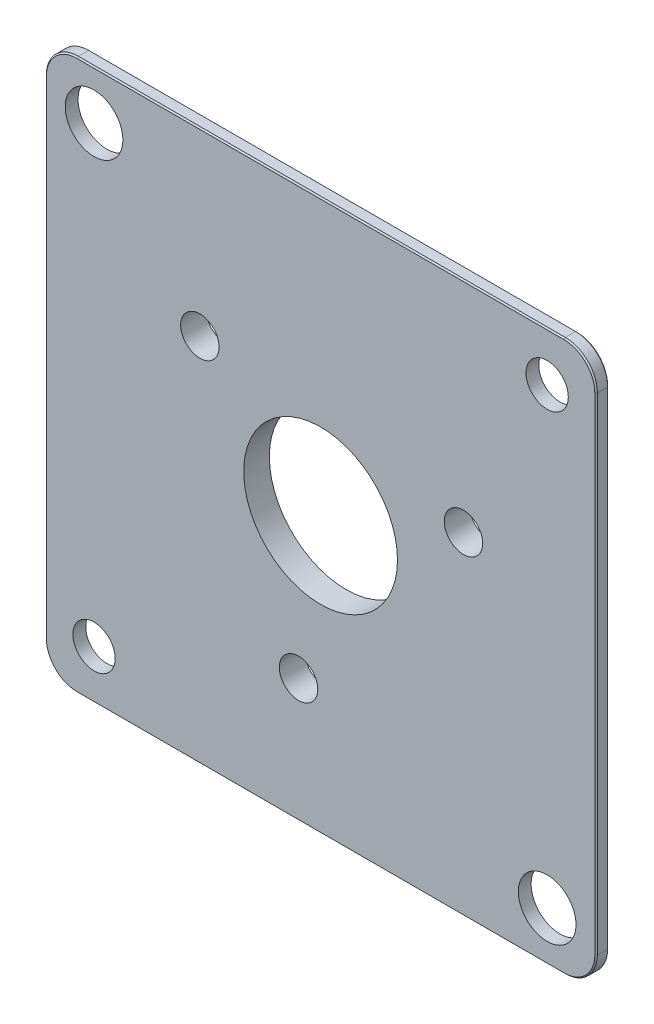
ISO-10303-21;
HEADER;
FILE_DESCRIPTION(('STEP AP214'),'2;1');
FILE_NAME('part.step','',(''),(''),'','','');
FILE_SCHEMA(('AUTOMOTIVE_DESIGN { 1 0 10303 214 1 1 1 1 }'));
ENDSEC;
DATA;
#1=APPLICATION_CONTEXT('core data for automotive mechanical design processes');
#2=APPLICATION_PROTOCOL_DEFINITION('international standard','automotive_design',2000,#1);
#3=PRODUCT_CONTEXT('',#1,'mechanical');
#4=PRODUCT('Part','Part','',(#3));
#5=PRODUCT_RELATED_PRODUCT_CATEGORY('part','',(#4));
#6=PRODUCT_DEFINITION_FORMATION('','',#4);
#7=PRODUCT_DEFINITION_CONTEXT('part definition',#1,'design');
#8=PRODUCT_DEFINITION('design','',#6,#7);
#9=PRODUCT_DEFINITION_SHAPE('','',#8);
#10=(LENGTH_UNIT() NAMED_UNIT(*) SI_UNIT(.MILLI.,.METRE.));
#11=(NAMED_UNIT(*) PLANE_ANGLE_UNIT() SI_UNIT($,.RADIAN.));
#12=(NAMED_UNIT(*) SI_UNIT($,.STERADIAN.) SOLID_ANGLE_UNIT());
#13=UNCERTAINTY_MEASURE_WITH_UNIT(LENGTH_MEASURE(1.E-05),#10,'distance_accuracy_value','');
#14=(GEOMETRIC_REPRESENTATION_CONTEXT(3) GLOBAL_UNCERTAINTY_ASSIGNED_CONTEXT((#13)) GLOBAL_UNIT_ASSIGNED_CONTEXT((#10,
#11,#12)) REPRESENTATION_CONTEXT('',''));
#15=CARTESIAN_POINT('',(0.,0.,0.));
#16=DIRECTION('',(0.,0.,1.));
#17=DIRECTION('',(1.,0.,0.));
#18=AXIS2_PLACEMENT_3D('',#15,#16,#17);
#19=CARTESIAN_POINT('',(0.,0.,0.5));
#20=DIRECTION('',(0.,0.,-1.));
#21=DIRECTION('',(-1.,0.,0.));
#22=AXIS2_PLACEMENT_3D('',#19,#20,#21);
#23=PLANE('',#22);
#24=CARTESIAN_POINT('',(-9.42,7.43,0.5));
#25=DIRECTION('',(0.,0.,1.));
#26=DIRECTION('',(1.,0.,0.));
#27=AXIS2_PLACEMENT_3D('',#24,#25,#26);
#28=CIRCLE('',#27,1.5);
#29=CARTESIAN_POINT('',(-7.92,7.43,0.5));
#30=VERTEX_POINT('',#29);
#31=EDGE_CURVE('E295',#30,#30,#28,.T.);
#32=ORIENTED_EDGE('',*,*,#31,.F.);
#33=EDGE_LOOP('',(#32));
#34=FACE_BOUND('',#33,.T.);
#35=CARTESIAN_POINT('',(11.15,4.45,0.5));
#36=DIRECTION('',(0.,0.,1.));
#37=DIRECTION('',(1.,0.,0.));
#38=AXIS2_PLACEMENT_3D('',#35,#36,#37);
#39=CIRCLE('',#38,1.5);
#40=CARTESIAN_POINT('',(12.65,4.45,0.5));
#41=VERTEX_POINT('',#40);
#42=EDGE_CURVE('E415',#41,#41,#39,.T.);
#43=ORIENTED_EDGE('',*,*,#42,.F.);
#44=EDGE_LOOP('',(#43));
#45=FACE_BOUND('',#44,.T.);
#46=CARTESIAN_POINT('',(-1.72,-11.85,0.5));
#47=DIRECTION('',(0.,0.,1.));
#48=DIRECTION('',(1.,0.,0.));
#49=AXIS2_PLACEMENT_3D('',#46,#47,#48);
#50=CIRCLE('',#49,1.5);
#51=CARTESIAN_POINT('',(-0.219999999999996,-11.85,0.5));
#52=VERTEX_POINT('',#51);
#53=EDGE_CURVE('E411',#52,#52,#50,.T.);
#54=ORIENTED_EDGE('',*,*,#53,.F.);
#55=EDGE_LOOP('',(#54));
#56=FACE_BOUND('',#55,.T.);
#57=CARTESIAN_POINT('',(19.,-19.,0.5));
#58=DIRECTION('',(0.,0.,-1.));
#59=DIRECTION('',(-1.,0.,0.));
#60=AXIS2_PLACEMENT_3D('',#57,#58,#59);
#61=CIRCLE('',#60,2.4);
#62=CARTESIAN_POINT('',(19.,-21.4,0.5));
#63=VERTEX_POINT('',#62);
#64=CARTESIAN_POINT('',(21.4,-19.,0.5));
#65=VERTEX_POINT('',#64);
#66=EDGE_CURVE('E70',#63,#65,#61,.F.);
#67=ORIENTED_EDGE('',*,*,#66,.T.);
#68=DIRECTION('',(0.,1.,0.));
#69=VECTOR('',#68,1.);
#70=CARTESIAN_POINT('',(21.4,0.,0.5));
#71=LINE('',#70,#69);
#72=CARTESIAN_POINT('',(21.4,19.,0.5));
#73=VERTEX_POINT('',#72);
#74=EDGE_CURVE('E58',#65,#73,#71,.T.);
#75=ORIENTED_EDGE('',*,*,#74,.T.);
#76=CARTESIAN_POINT('',(19.,19.,0.5));
#77=DIRECTION('',(0.,0.,-1.));
#78=DIRECTION('',(-1.,0.,0.));
#79=AXIS2_PLACEMENT_3D('',#76,#77,#78);
#80=CIRCLE('',#79,2.4);
#81=CARTESIAN_POINT('',(19.,21.4,0.5));
#82=VERTEX_POINT('',#81);
#83=EDGE_CURVE('E255',#73,#82,#80,.F.);
#84=ORIENTED_EDGE('',*,*,#83,.T.);
#85=DIRECTION('',(-1.,0.,0.));
#86=VECTOR('',#85,1.);
#87=CARTESIAN_POINT('',(0.,21.4,0.5));
#88=LINE('',#87,#86);
#89=CARTESIAN_POINT('',(-19.,21.4,0.5));
#90=VERTEX_POINT('',#89);
#91=EDGE_CURVE('E249',#82,#90,#88,.T.);
#92=ORIENTED_EDGE('',*,*,#91,.T.);
#93=CARTESIAN_POINT('',(-19.,19.,0.5));
#94=DIRECTION('',(0.,0.,-1.));
#95=DIRECTION('',(-1.,0.,0.));
#96=AXIS2_PLACEMENT_3D('',#93,#94,#95);
#97=CIRCLE('',#96,2.4);
#98=CARTESIAN_POINT('',(-21.4,19.,0.5));
#99=VERTEX_POINT('',#98);
#100=EDGE_CURVE('E244',#90,#99,#97,.F.);
#101=ORIENTED_EDGE('',*,*,#100,.T.);
#102=DIRECTION('',(0.,-1.,0.));
#103=VECTOR('',#102,1.);
#104=CARTESIAN_POINT('',(-21.4,0.,0.5));
#105=LINE('',#104,#103);
#106=CARTESIAN_POINT('',(-21.4,-19.,0.5));
#107=VERTEX_POINT('',#106);
#108=EDGE_CURVE('E238',#99,#107,#105,.T.);
#109=ORIENTED_EDGE('',*,*,#108,.T.);
#110=CARTESIAN_POINT('',(-19.,-19.,0.5));
#111=DIRECTION('',(0.,0.,-1.));
#112=DIRECTION('',(-1.,0.,0.));
#113=AXIS2_PLACEMENT_3D('',#110,#111,#112);
#114=CIRCLE('',#113,2.4);
#115=CARTESIAN_POINT('',(-19.,-21.4,0.5));
#116=VERTEX_POINT('',#115);
#117=EDGE_CURVE('E241',#107,#116,#114,.F.);
#118=ORIENTED_EDGE('',*,*,#117,.T.);
#119=DIRECTION('',(1.,0.,0.));
#120=VECTOR('',#119,1.);
#121=CARTESIAN_POINT('',(0.,-21.4,0.5));
#122=LINE('',#121,#120);
#123=EDGE_CURVE('E193',#116,#63,#122,.T.);
#124=ORIENTED_EDGE('',*,*,#123,.T.);
#125=EDGE_LOOP('',(#67,#75,#84,#92,#101,#109,#118,#124));
#126=FACE_BOUND('',#125,.T.);
#127=CARTESIAN_POINT('',(0.,0.,0.5));
#128=DIRECTION('',(0.,0.,1.));
#129=DIRECTION('',(1.,0.,0.));
#130=AXIS2_PLACEMENT_3D('',#127,#128,#129);
#131=CIRCLE('',#130,6.);
#132=CARTESIAN_POINT('',(6.,0.,0.5));
#133=VERTEX_POINT('',#132);
#134=EDGE_CURVE('E290',#133,#133,#131,.T.);
#135=ORIENTED_EDGE('',*,*,#134,.F.);
#136=EDGE_LOOP('',(#135));
#137=FACE_BOUND('',#136,.T.);
#138=CARTESIAN_POINT('',(-17.68,17.68,0.5));
#139=DIRECTION('',(0.,0.,1.));
#140=DIRECTION('',(1.,0.,0.));
#141=AXIS2_PLACEMENT_3D('',#138,#139,#140);
#142=CIRCLE('',#141,2.25);
#143=CARTESIAN_POINT('',(-15.43,17.68,0.5));
#144=VERTEX_POINT('',#143);
#145=EDGE_CURVE('E376',#144,#144,#142,.T.);
#146=ORIENTED_EDGE('',*,*,#145,.F.);
#147=EDGE_LOOP('',(#146));
#148=FACE_BOUND('',#147,.T.);
#149=CARTESIAN_POINT('',(17.68,-17.68,0.5));
#150=DIRECTION('',(0.,0.,1.));
#151=DIRECTION('',(1.,0.,0.));
#152=AXIS2_PLACEMENT_3D('',#149,#150,#151);
#153=CIRCLE('',#152,2.25);
#154=CARTESIAN_POINT('',(19.93,-17.68,0.5));
#155=VERTEX_POINT('',#154);
#156=EDGE_CURVE('E381',#155,#155,#153,.T.);
#157=ORIENTED_EDGE('',*,*,#156,.F.);
#158=EDGE_LOOP('',(#157));
#159=FACE_BOUND('',#158,.T.);
#160=CARTESIAN_POINT('',(17.68,17.68,0.5));
#161=DIRECTION('',(0.,0.,1.));
#162=DIRECTION('',(1.,0.,0.));
#163=AXIS2_PLACEMENT_3D('',#160,#161,#162);
#164=CIRCLE('',#163,1.65);
#165=CARTESIAN_POINT('',(19.33,17.68,0.5));
#166=VERTEX_POINT('',#165);
#167=EDGE_CURVE('E389',#166,#166,#164,.T.);
#168=ORIENTED_EDGE('',*,*,#167,.F.);
#169=EDGE_LOOP('',(#168));
#170=FACE_BOUND('',#169,.T.);
#171=CARTESIAN_POINT('',(-17.68,-17.68,0.5));
#172=DIRECTION('',(0.,0.,1.));
#173=DIRECTION('',(1.,0.,0.));
#174=AXIS2_PLACEMENT_3D('',#171,#172,#173);
#175=CIRCLE('',#174,1.65);
#176=CARTESIAN_POINT('',(-16.03,-17.68,0.5));
#177=VERTEX_POINT('',#176);
#178=EDGE_CURVE('E397',#177,#177,#175,.T.);
#179=ORIENTED_EDGE('',*,*,#178,.F.);
#180=EDGE_LOOP('',(#179));
#181=FACE_BOUND('',#180,.T.);
#182=ADVANCED_FACE('F47',(#34,#45,#56,#126,#137,#148,#159,#170,#181),#23,.F.);
#183=CARTESIAN_POINT('',(0.,0.,-0.5));
#184=DIRECTION('',(0.,0.,-1.));
#185=DIRECTION('',(-1.,0.,0.));
#186=AXIS2_PLACEMENT_3D('',#183,#184,#185);
#187=PLANE('',#186);
#188=CARTESIAN_POINT('',(0.,0.,-0.5));
#189=DIRECTION('',(0.,0.,-1.));
#190=DIRECTION('',(-1.,0.,0.));
#191=AXIS2_PLACEMENT_3D('',#188,#189,#190);
#192=CIRCLE('',#191,16.);
#193=CARTESIAN_POINT('',(-16.,0.,-0.5));
#194=VERTEX_POINT('',#193);
#195=EDGE_CURVE('E11',#194,#194,#192,.T.);
#196=ORIENTED_EDGE('',*,*,#195,.F.);
#197=EDGE_LOOP('',(#196));
#198=FACE_BOUND('',#197,.T.);
#199=DIRECTION('',(0.,-1.,0.));
#200=VECTOR('',#199,1.);
#201=CARTESIAN_POINT('',(21.4,-19.,-0.5));
#202=LINE('',#201,#200);
#203=CARTESIAN_POINT('',(21.4,19.,-0.5));
#204=VERTEX_POINT('',#203);
#205=CARTESIAN_POINT('',(21.4,-19.,-0.5));
#206=VERTEX_POINT('',#205);
#207=EDGE_CURVE('E333',#204,#206,#202,.T.);
#208=ORIENTED_EDGE('',*,*,#207,.T.);
#209=CARTESIAN_POINT('',(19.,-19.,-0.5));
#210=DIRECTION('',(0.,0.,-1.));
#211=DIRECTION('',(-1.,0.,0.));
#212=AXIS2_PLACEMENT_3D('',#209,#210,#211);
#213=CIRCLE('',#212,2.4);
#214=CARTESIAN_POINT('',(19.,-21.4,-0.5));
#215=VERTEX_POINT('',#214);
#216=EDGE_CURVE('E326',#206,#215,#213,.T.);
#217=ORIENTED_EDGE('',*,*,#216,.T.);
#218=DIRECTION('',(-1.,0.,0.));
#219=VECTOR('',#218,1.);
#220=CARTESIAN_POINT('',(-19.,-21.4,-0.5));
#221=LINE('',#220,#219);
#222=CARTESIAN_POINT('',(-19.,-21.4,-0.5));
#223=VERTEX_POINT('',#222);
#224=EDGE_CURVE('E329',#215,#223,#221,.T.);
#225=ORIENTED_EDGE('',*,*,#224,.T.);
#226=CARTESIAN_POINT('',(-19.,-19.,-0.5));
#227=DIRECTION('',(0.,0.,-1.));
#228=DIRECTION('',(-1.,0.,0.));
#229=AXIS2_PLACEMENT_3D('',#226,#227,#228);
#230=CIRCLE('',#229,2.4);
#231=CARTESIAN_POINT('',(-21.4,-19.,-0.5));
#232=VERTEX_POINT('',#231);
#233=EDGE_CURVE('E336',#223,#232,#230,.T.);
#234=ORIENTED_EDGE('',*,*,#233,.T.);
#235=DIRECTION('',(0.,1.,0.));
#236=VECTOR('',#235,1.);
#237=CARTESIAN_POINT('',(-21.4,19.,-0.5));
#238=LINE('',#237,#236);
#239=CARTESIAN_POINT('',(-21.4,19.,-0.5));
#240=VERTEX_POINT('',#239);
#241=EDGE_CURVE('E339',#232,#240,#238,.T.);
#242=ORIENTED_EDGE('',*,*,#241,.T.);
#243=CARTESIAN_POINT('',(-19.,19.,-0.5));
#244=DIRECTION('',(0.,0.,-1.));
#245=DIRECTION('',(-1.,0.,0.));
#246=AXIS2_PLACEMENT_3D('',#243,#244,#245);
#247=CIRCLE('',#246,2.4);
#248=CARTESIAN_POINT('',(-19.,21.4,-0.5));
#249=VERTEX_POINT('',#248);
#250=EDGE_CURVE('E345',#240,#249,#247,.T.);
#251=ORIENTED_EDGE('',*,*,#250,.T.);
#252=DIRECTION('',(1.,0.,0.));
#253=VECTOR('',#252,1.);
#254=CARTESIAN_POINT('',(19.,21.4,-0.5));
#255=LINE('',#254,#253);
#256=CARTESIAN_POINT('',(19.,21.4,-0.5));
#257=VERTEX_POINT('',#256);
#258=EDGE_CURVE('E348',#249,#257,#255,.T.);
#259=ORIENTED_EDGE('',*,*,#258,.T.);
#260=CARTESIAN_POINT('',(19.,19.,-0.5));
#261=DIRECTION('',(0.,0.,-1.));
#262=DIRECTION('',(-1.,0.,0.));
#263=AXIS2_PLACEMENT_3D('',#260,#261,#262);
#264=CIRCLE('',#263,2.4);
#265=EDGE_CURVE('E342',#257,#204,#264,.T.);
#266=ORIENTED_EDGE('',*,*,#265,.T.);
#267=EDGE_LOOP('',(#208,#217,#225,#234,#242,#251,#259,#266));
#268=FACE_BOUND('',#267,.T.);
#269=CARTESIAN_POINT('',(17.68,17.68,-0.5));
#270=DIRECTION('',(0.,0.,1.));
#271=DIRECTION('',(1.,0.,0.));
#272=AXIS2_PLACEMENT_3D('',#269,#270,#271);
#273=CIRCLE('',#272,1.65);
#274=CARTESIAN_POINT('',(19.33,17.68,-0.5));
#275=VERTEX_POINT('',#274);
#276=EDGE_CURVE('E393',#275,#275,#273,.T.);
#277=ORIENTED_EDGE('',*,*,#276,.T.);
#278=EDGE_LOOP('',(#277));
#279=FACE_BOUND('',#278,.T.);
#280=CARTESIAN_POINT('',(-17.68,17.68,-0.5));
#281=DIRECTION('',(0.,0.,1.));
#282=DIRECTION('',(1.,0.,0.));
#283=AXIS2_PLACEMENT_3D('',#280,#281,#282);
#284=CIRCLE('',#283,2.25);
#285=CARTESIAN_POINT('',(-15.43,17.68,-0.5));
#286=VERTEX_POINT('',#285);
#287=EDGE_CURVE('E377',#286,#286,#284,.T.);
#288=ORIENTED_EDGE('',*,*,#287,.T.);
#289=EDGE_LOOP('',(#288));
#290=FACE_BOUND('',#289,.T.);
#291=CARTESIAN_POINT('',(17.68,-17.68,-0.5));
#292=DIRECTION('',(0.,0.,1.));
#293=DIRECTION('',(1.,0.,0.));
#294=AXIS2_PLACEMENT_3D('',#291,#292,#293);
#295=CIRCLE('',#294,2.25);
#296=CARTESIAN_POINT('',(19.93,-17.68,-0.5));
#297=VERTEX_POINT('',#296);
#298=EDGE_CURVE('E385',#297,#297,#295,.T.);
#299=ORIENTED_EDGE('',*,*,#298,.T.);
#300=EDGE_LOOP('',(#299));
#301=FACE_BOUND('',#300,.T.);
#302=CARTESIAN_POINT('',(-17.68,-17.68,-0.5));
#303=DIRECTION('',(0.,0.,1.));
#304=DIRECTION('',(1.,0.,0.));
#305=AXIS2_PLACEMENT_3D('',#302,#303,#304);
#306=CIRCLE('',#305,1.65);
#307=CARTESIAN_POINT('',(-16.03,-17.68,-0.5));
#308=VERTEX_POINT('',#307);
#309=EDGE_CURVE('E401',#308,#308,#306,.T.);
#310=ORIENTED_EDGE('',*,*,#309,.T.);
#311=EDGE_LOOP('',(#310));
#312=FACE_BOUND('',#311,.T.);
#313=ADVANCED_FACE('F463',(#198,#268,#279,#290,#301,#312),#187,.T.);
#314=CARTESIAN_POINT('',(21.5,-21.5,0.5));
#315=DIRECTION('',(-1.,0.,0.));
#316=DIRECTION('',(0.,0.,1.));
#317=AXIS2_PLACEMENT_3D('',#314,#315,#316);
#318=PLANE('',#317);
#319=DIRECTION('',(0.,0.,-1.));
#320=VECTOR('',#319,1.);
#321=CARTESIAN_POINT('',(21.5,-19.,0.5));
#322=LINE('',#321,#320);
#323=CARTESIAN_POINT('',(21.5,-19.,0.399999999999997));
#324=VERTEX_POINT('',#323);
#325=CARTESIAN_POINT('',(21.5,-19.,-0.399999999999997));
#326=VERTEX_POINT('',#325);
#327=EDGE_CURVE('E360',#324,#326,#322,.T.);
#328=ORIENTED_EDGE('',*,*,#327,.T.);
#329=DIRECTION('',(0.,1.,0.));
#330=VECTOR('',#329,1.);
#331=CARTESIAN_POINT('',(21.5,19.,-0.399999999999997));
#332=LINE('',#331,#330);
#333=CARTESIAN_POINT('',(21.5,19.,-0.399999999999997));
#334=VERTEX_POINT('',#333);
#335=EDGE_CURVE('E320',#326,#334,#332,.T.);
#336=ORIENTED_EDGE('',*,*,#335,.T.);
#337=DIRECTION('',(0.,0.,-1.));
#338=VECTOR('',#337,1.);
#339=CARTESIAN_POINT('',(21.5,19.,0.5));
#340=LINE('',#339,#338);
#341=CARTESIAN_POINT('',(21.5,19.,0.399999999999997));
#342=VERTEX_POINT('',#341);
#343=EDGE_CURVE('E364',#334,#342,#340,.F.);
#344=ORIENTED_EDGE('',*,*,#343,.T.);
#345=DIRECTION('',(0.,-1.,0.));
#346=VECTOR('',#345,1.);
#347=CARTESIAN_POINT('',(21.5,-21.5,0.399999999999997));
#348=LINE('',#347,#346);
#349=EDGE_CURVE('E313',#342,#324,#348,.T.);
#350=ORIENTED_EDGE('',*,*,#349,.T.);
#351=EDGE_LOOP('',(#328,#336,#344,#350));
#352=FACE_BOUND('',#351,.T.);
#353=ADVANCED_FACE('F470',(#352),#318,.F.);
#354=CARTESIAN_POINT('',(-21.5,21.5,0.5));
#355=DIRECTION('',(0.,-1.,0.));
#356=DIRECTION('',(0.,0.,-1.));
#357=AXIS2_PLACEMENT_3D('',#354,#355,#356);
#358=PLANE('',#357);
#359=DIRECTION('',(0.,0.,-1.));
#360=VECTOR('',#359,1.);
#361=CARTESIAN_POINT('',(19.,21.5,0.5));
#362=LINE('',#361,#360);
#363=CARTESIAN_POINT('',(19.,21.5,0.399999999999997));
#364=VERTEX_POINT('',#363);
#365=CARTESIAN_POINT('',(19.,21.5,-0.399999999999997));
#366=VERTEX_POINT('',#365);
#367=EDGE_CURVE('E177',#364,#366,#362,.T.);
#368=ORIENTED_EDGE('',*,*,#367,.T.);
#369=DIRECTION('',(-1.,0.,0.));
#370=VECTOR('',#369,1.);
#371=CARTESIAN_POINT('',(-19.,21.5,-0.399999999999997));
#372=LINE('',#371,#370);
#373=CARTESIAN_POINT('',(-19.,21.5,-0.399999999999997));
#374=VERTEX_POINT('',#373);
#375=EDGE_CURVE('E235',#366,#374,#372,.T.);
#376=ORIENTED_EDGE('',*,*,#375,.T.);
#377=DIRECTION('',(0.,0.,-1.));
#378=VECTOR('',#377,1.);
#379=CARTESIAN_POINT('',(-19.,21.5,0.5));
#380=LINE('',#379,#378);
#381=CARTESIAN_POINT('',(-19.,21.5,0.399999999999997));
#382=VERTEX_POINT('',#381);
#383=EDGE_CURVE('E356',#374,#382,#380,.F.);
#384=ORIENTED_EDGE('',*,*,#383,.T.);
#385=DIRECTION('',(1.,0.,0.));
#386=VECTOR('',#385,1.);
#387=CARTESIAN_POINT('',(-21.5,21.5,0.399999999999997));
#388=LINE('',#387,#386);
#389=EDGE_CURVE('E231',#382,#364,#388,.T.);
#390=ORIENTED_EDGE('',*,*,#389,.T.);
#391=EDGE_LOOP('',(#368,#376,#384,#390));
#392=FACE_BOUND('',#391,.T.);
#393=ADVANCED_FACE('F484',(#392),#358,.F.);
#394=CARTESIAN_POINT('',(-21.5,-21.5,0.5));
#395=DIRECTION('',(1.,0.,0.));
#396=DIRECTION('',(0.,0.,-1.));
#397=AXIS2_PLACEMENT_3D('',#394,#395,#396);
#398=PLANE('',#397);
#399=DIRECTION('',(0.,0.,-1.));
#400=VECTOR('',#399,1.);
#401=CARTESIAN_POINT('',(-21.5,19.,0.5));
#402=LINE('',#401,#400);
#403=CARTESIAN_POINT('',(-21.5,19.,0.399999999999997));
#404=VERTEX_POINT('',#403);
#405=CARTESIAN_POINT('',(-21.5,19.,-0.399999999999997));
#406=VERTEX_POINT('',#405);
#407=EDGE_CURVE('E188',#404,#406,#402,.T.);
#408=ORIENTED_EDGE('',*,*,#407,.T.);
#409=DIRECTION('',(0.,-1.,0.));
#410=VECTOR('',#409,1.);
#411=CARTESIAN_POINT('',(-21.5,-19.,-0.399999999999997));
#412=LINE('',#411,#410);
#413=CARTESIAN_POINT('',(-21.5,-19.,-0.399999999999997));
#414=VERTEX_POINT('',#413);
#415=EDGE_CURVE('E216',#406,#414,#412,.T.);
#416=ORIENTED_EDGE('',*,*,#415,.T.);
#417=DIRECTION('',(0.,0.,-1.));
#418=VECTOR('',#417,1.);
#419=CARTESIAN_POINT('',(-21.5,-19.,0.5));
#420=LINE('',#419,#418);
#421=CARTESIAN_POINT('',(-21.5,-19.,0.399999999999997));
#422=VERTEX_POINT('',#421);
#423=EDGE_CURVE('E368',#414,#422,#420,.F.);
#424=ORIENTED_EDGE('',*,*,#423,.T.);
#425=DIRECTION('',(0.,1.,0.));
#426=VECTOR('',#425,1.);
#427=CARTESIAN_POINT('',(-21.5,-21.5,0.399999999999997));
#428=LINE('',#427,#426);
#429=EDGE_CURVE('E208',#422,#404,#428,.T.);
#430=ORIENTED_EDGE('',*,*,#429,.T.);
#431=EDGE_LOOP('',(#408,#416,#424,#430));
#432=FACE_BOUND('',#431,.T.);
#433=ADVANCED_FACE('F481',(#432),#398,.F.);
#434=CARTESIAN_POINT('',(-21.5,-21.5,0.5));
#435=DIRECTION('',(0.,1.,0.));
#436=DIRECTION('',(0.,0.,1.));
#437=AXIS2_PLACEMENT_3D('',#434,#435,#436);
#438=PLANE('',#437);
#439=DIRECTION('',(0.,0.,-1.));
#440=VECTOR('',#439,1.);
#441=CARTESIAN_POINT('',(-19.,-21.5,0.5));
#442=LINE('',#441,#440);
#443=CARTESIAN_POINT('',(-19.,-21.5,0.399999999999997));
#444=VERTEX_POINT('',#443);
#445=CARTESIAN_POINT('',(-19.,-21.5,-0.399999999999997));
#446=VERTEX_POINT('',#445);
#447=EDGE_CURVE('E167',#444,#446,#442,.T.);
#448=ORIENTED_EDGE('',*,*,#447,.T.);
#449=DIRECTION('',(1.,0.,0.));
#450=VECTOR('',#449,1.);
#451=CARTESIAN_POINT('',(19.,-21.5,-0.399999999999997));
#452=LINE('',#451,#450);
#453=CARTESIAN_POINT('',(19.,-21.5,-0.399999999999997));
#454=VERTEX_POINT('',#453);
#455=EDGE_CURVE('E176',#446,#454,#452,.T.);
#456=ORIENTED_EDGE('',*,*,#455,.T.);
#457=DIRECTION('',(0.,0.,-1.));
#458=VECTOR('',#457,1.);
#459=CARTESIAN_POINT('',(19.,-21.5,0.5));
#460=LINE('',#459,#458);
#461=CARTESIAN_POINT('',(19.,-21.5,0.399999999999997));
#462=VERTEX_POINT('',#461);
#463=EDGE_CURVE('E170',#454,#462,#460,.F.);
#464=ORIENTED_EDGE('',*,*,#463,.T.);
#465=DIRECTION('',(-1.,0.,0.));
#466=VECTOR('',#465,1.);
#467=CARTESIAN_POINT('',(-21.5,-21.5,0.399999999999997));
#468=LINE('',#467,#466);
#469=EDGE_CURVE('E163',#462,#444,#468,.T.);
#470=ORIENTED_EDGE('',*,*,#469,.T.);
#471=EDGE_LOOP('',(#448,#456,#464,#470));
#472=FACE_BOUND('',#471,.T.);
#473=ADVANCED_FACE('F165',(#472),#438,.F.);
#474=CARTESIAN_POINT('',(-17.68,17.68,0.5));
#475=DIRECTION('',(0.,0.,-1.));
#476=DIRECTION('',(-1.,0.,0.));
#477=AXIS2_PLACEMENT_3D('',#474,#475,#476);
#478=CYLINDRICAL_SURFACE('',#477,2.25);
#479=ORIENTED_EDGE('',*,*,#145,.T.);
#480=EDGE_LOOP('',(#479));
#481=FACE_BOUND('',#480,.T.);
#482=ORIENTED_EDGE('',*,*,#287,.F.);
#483=EDGE_LOOP('',(#482));
#484=FACE_BOUND('',#483,.T.);
#485=ADVANCED_FACE('F476',(#481,#484),#478,.F.);
#486=CARTESIAN_POINT('',(17.68,-17.68,0.5));
#487=DIRECTION('',(0.,0.,-1.));
#488=DIRECTION('',(-1.,0.,0.));
#489=AXIS2_PLACEMENT_3D('',#486,#487,#488);
#490=CYLINDRICAL_SURFACE('',#489,2.25);
#491=ORIENTED_EDGE('',*,*,#156,.T.);
#492=EDGE_LOOP('',(#491));
#493=FACE_BOUND('',#492,.T.);
#494=ORIENTED_EDGE('',*,*,#298,.F.);
#495=EDGE_LOOP('',(#494));
#496=FACE_BOUND('',#495,.T.);
#497=ADVANCED_FACE('F707',(#493,#496),#490,.F.);
#498=CARTESIAN_POINT('',(17.68,17.68,0.5));
#499=DIRECTION('',(0.,0.,-1.));
#500=DIRECTION('',(-1.,0.,0.));
#501=AXIS2_PLACEMENT_3D('',#498,#499,#500);
#502=CYLINDRICAL_SURFACE('',#501,1.65);
#503=ORIENTED_EDGE('',*,*,#167,.T.);
#504=EDGE_LOOP('',(#503));
#505=FACE_BOUND('',#504,.T.);
#506=ORIENTED_EDGE('',*,*,#276,.F.);
#507=EDGE_LOOP('',(#506));
#508=FACE_BOUND('',#507,.T.);
#509=ADVANCED_FACE('F698',(#505,#508),#502,.F.);
#510=CARTESIAN_POINT('',(-17.68,-17.68,0.5));
#511=DIRECTION('',(0.,0.,-1.));
#512=DIRECTION('',(-1.,0.,0.));
#513=AXIS2_PLACEMENT_3D('',#510,#511,#512);
#514=CYLINDRICAL_SURFACE('',#513,1.65);
#515=ORIENTED_EDGE('',*,*,#178,.T.);
#516=EDGE_LOOP('',(#515));
#517=FACE_BOUND('',#516,.T.);
#518=ORIENTED_EDGE('',*,*,#309,.F.);
#519=EDGE_LOOP('',(#518));
#520=FACE_BOUND('',#519,.T.);
#521=ADVANCED_FACE('F694',(#517,#520),#514,.F.);
#522=CARTESIAN_POINT('',(0.,0.,-0.5));
#523=DIRECTION('',(0.,0.,1.));
#524=DIRECTION('',(1.,0.,0.));
#525=AXIS2_PLACEMENT_3D('',#522,#523,#524);
#526=CYLINDRICAL_SURFACE('',#525,6.);
#527=ORIENTED_EDGE('',*,*,#134,.T.);
#528=EDGE_LOOP('',(#527));
#529=FACE_BOUND('',#528,.T.);
#530=CARTESIAN_POINT('',(0.,0.,-1.5));
#531=DIRECTION('',(0.,0.,-1.));
#532=DIRECTION('',(-1.,0.,0.));
#533=AXIS2_PLACEMENT_3D('',#530,#531,#532);
#534=CIRCLE('',#533,6.);
#535=CARTESIAN_POINT('',(-6.,0.,-1.5));
#536=VERTEX_POINT('',#535);
#537=EDGE_CURVE('E426',#536,#536,#534,.T.);
#538=ORIENTED_EDGE('',*,*,#537,.T.);
#539=EDGE_LOOP('',(#538));
#540=FACE_BOUND('',#539,.T.);
#541=ADVANCED_FACE('F495',(#529,#540),#526,.F.);
#542=CARTESIAN_POINT('',(-19.,-19.,0.5));
#543=DIRECTION('',(0.,0.,-1.));
#544=DIRECTION('',(-1.,0.,0.));
#545=AXIS2_PLACEMENT_3D('',#542,#543,#544);
#546=CYLINDRICAL_SURFACE('',#545,2.5);
#547=ORIENTED_EDGE('',*,*,#423,.F.);
#548=CARTESIAN_POINT('',(-19.,-19.,-0.399999999999997));
#549=DIRECTION('',(0.,0.,-1.));
#550=DIRECTION('',(-1.,0.,0.));
#551=AXIS2_PLACEMENT_3D('',#548,#549,#550);
#552=CIRCLE('',#551,2.5);
#553=EDGE_CURVE('E186',#414,#446,#552,.F.);
#554=ORIENTED_EDGE('',*,*,#553,.T.);
#555=ORIENTED_EDGE('',*,*,#447,.F.);
#556=CARTESIAN_POINT('',(-19.,-19.,0.399999999999997));
#557=DIRECTION('',(0.,0.,-1.));
#558=DIRECTION('',(-1.,0.,0.));
#559=AXIS2_PLACEMENT_3D('',#556,#557,#558);
#560=CIRCLE('',#559,2.5);
#561=EDGE_CURVE('E183',#444,#422,#560,.T.);
#562=ORIENTED_EDGE('',*,*,#561,.T.);
#563=EDGE_LOOP('',(#547,#554,#555,#562));
#564=FACE_BOUND('',#563,.T.);
#565=ADVANCED_FACE('F181',(#564),#546,.T.);
#566=CARTESIAN_POINT('',(19.,-19.,0.5));
#567=DIRECTION('',(0.,0.,-1.));
#568=DIRECTION('',(-1.,0.,0.));
#569=AXIS2_PLACEMENT_3D('',#566,#567,#568);
#570=CYLINDRICAL_SURFACE('',#569,2.5);
#571=ORIENTED_EDGE('',*,*,#463,.F.);
#572=CARTESIAN_POINT('',(19.,-19.,-0.399999999999997));
#573=DIRECTION('',(0.,0.,-1.));
#574=DIRECTION('',(-1.,0.,0.));
#575=AXIS2_PLACEMENT_3D('',#572,#573,#574);
#576=CIRCLE('',#575,2.5);
#577=EDGE_CURVE('E204',#454,#326,#576,.F.);
#578=ORIENTED_EDGE('',*,*,#577,.T.);
#579=ORIENTED_EDGE('',*,*,#327,.F.);
#580=CARTESIAN_POINT('',(19.,-19.,0.399999999999997));
#581=DIRECTION('',(0.,0.,-1.));
#582=DIRECTION('',(-1.,0.,0.));
#583=AXIS2_PLACEMENT_3D('',#580,#581,#582);
#584=CIRCLE('',#583,2.5);
#585=EDGE_CURVE('E210',#324,#462,#584,.T.);
#586=ORIENTED_EDGE('',*,*,#585,.T.);
#587=EDGE_LOOP('',(#571,#578,#579,#586));
#588=FACE_BOUND('',#587,.T.);
#589=ADVANCED_FACE('F494',(#588),#570,.T.);
#590=CARTESIAN_POINT('',(19.,19.,0.5));
#591=DIRECTION('',(0.,0.,-1.));
#592=DIRECTION('',(-1.,0.,0.));
#593=AXIS2_PLACEMENT_3D('',#590,#591,#592);
#594=CYLINDRICAL_SURFACE('',#593,2.5);
#595=ORIENTED_EDGE('',*,*,#343,.F.);
#596=CARTESIAN_POINT('',(19.,19.,-0.399999999999997));
#597=DIRECTION('',(0.,0.,-1.));
#598=DIRECTION('',(-1.,0.,0.));
#599=AXIS2_PLACEMENT_3D('',#596,#597,#598);
#600=CIRCLE('',#599,2.5);
#601=EDGE_CURVE('E222',#334,#366,#600,.F.);
#602=ORIENTED_EDGE('',*,*,#601,.T.);
#603=ORIENTED_EDGE('',*,*,#367,.F.);
#604=CARTESIAN_POINT('',(19.,19.,0.399999999999997));
#605=DIRECTION('',(0.,0.,-1.));
#606=DIRECTION('',(-1.,0.,0.));
#607=AXIS2_PLACEMENT_3D('',#604,#605,#606);
#608=CIRCLE('',#607,2.5);
#609=EDGE_CURVE('E219',#364,#342,#608,.T.);
#610=ORIENTED_EDGE('',*,*,#609,.T.);
#611=EDGE_LOOP('',(#595,#602,#603,#610));
#612=FACE_BOUND('',#611,.T.);
#613=ADVANCED_FACE('F498',(#612),#594,.T.);
#614=CARTESIAN_POINT('',(-19.,19.,0.5));
#615=DIRECTION('',(0.,0.,-1.));
#616=DIRECTION('',(-1.,0.,0.));
#617=AXIS2_PLACEMENT_3D('',#614,#615,#616);
#618=CYLINDRICAL_SURFACE('',#617,2.5);
#619=ORIENTED_EDGE('',*,*,#383,.F.);
#620=CARTESIAN_POINT('',(-19.,19.,-0.399999999999997));
#621=DIRECTION('',(0.,0.,-1.));
#622=DIRECTION('',(-1.,0.,0.));
#623=AXIS2_PLACEMENT_3D('',#620,#621,#622);
#624=CIRCLE('',#623,2.5);
#625=EDGE_CURVE('E228',#374,#406,#624,.F.);
#626=ORIENTED_EDGE('',*,*,#625,.T.);
#627=ORIENTED_EDGE('',*,*,#407,.F.);
#628=CARTESIAN_POINT('',(-19.,19.,0.399999999999997));
#629=DIRECTION('',(0.,0.,-1.));
#630=DIRECTION('',(-1.,0.,0.));
#631=AXIS2_PLACEMENT_3D('',#628,#629,#630);
#632=CIRCLE('',#631,2.5);
#633=EDGE_CURVE('E225',#404,#382,#632,.T.);
#634=ORIENTED_EDGE('',*,*,#633,.T.);
#635=EDGE_LOOP('',(#619,#626,#627,#634));
#636=FACE_BOUND('',#635,.T.);
#637=ADVANCED_FACE('F501',(#636),#618,.T.);
#638=CARTESIAN_POINT('',(-21.5,21.5,-0.399999999999997));
#639=DIRECTION('',(0.,0.707106781186548,-0.707106781186548));
#640=DIRECTION('',(1.,0.,0.));
#641=AXIS2_PLACEMENT_3D('',#638,#639,#640);
#642=PLANE('',#641);
#643=DIRECTION('',(0.,0.707106781186548,0.707106781186548));
#644=VECTOR('',#643,1.);
#645=CARTESIAN_POINT('',(19.,21.4,-0.5));
#646=LINE('',#645,#644);
#647=EDGE_CURVE('E282',#257,#366,#646,.T.);
#648=ORIENTED_EDGE('',*,*,#647,.F.);
#649=ORIENTED_EDGE('',*,*,#258,.F.);
#650=DIRECTION('',(0.,-0.707106781186548,-0.707106781186548));
#651=VECTOR('',#650,1.);
#652=CARTESIAN_POINT('',(-19.,21.5,-0.399999999999997));
#653=LINE('',#652,#651);
#654=EDGE_CURVE('E286',#374,#249,#653,.T.);
#655=ORIENTED_EDGE('',*,*,#654,.F.);
#656=ORIENTED_EDGE('',*,*,#375,.F.);
#657=EDGE_LOOP('',(#648,#649,#655,#656));
#658=FACE_BOUND('',#657,.T.);
#659=ADVANCED_FACE('F505',(#658),#642,.T.);
#660=CARTESIAN_POINT('',(-19.,19.,-0.5));
#661=DIRECTION('',(0.,0.,1.));
#662=DIRECTION('',(1.,0.,0.));
#663=AXIS2_PLACEMENT_3D('',#660,#661,#662);
#664=CONICAL_SURFACE('',#663,2.4,0.785398163397455);
#665=ORIENTED_EDGE('',*,*,#654,.T.);
#666=ORIENTED_EDGE('',*,*,#250,.F.);
#667=DIRECTION('',(0.707106781186548,0.,-0.707106781186548));
#668=VECTOR('',#667,1.);
#669=CARTESIAN_POINT('',(-21.5,19.,-0.399999999999997));
#670=LINE('',#669,#668);
#671=EDGE_CURVE('E278',#406,#240,#670,.T.);
#672=ORIENTED_EDGE('',*,*,#671,.F.);
#673=ORIENTED_EDGE('',*,*,#625,.F.);
#674=EDGE_LOOP('',(#665,#666,#672,#673));
#675=FACE_BOUND('',#674,.T.);
#676=ADVANCED_FACE('F549',(#675),#664,.T.);
#677=CARTESIAN_POINT('',(19.,19.,-0.5));
#678=DIRECTION('',(0.,0.,1.));
#679=DIRECTION('',(1.,0.,0.));
#680=AXIS2_PLACEMENT_3D('',#677,#678,#679);
#681=CONICAL_SURFACE('',#680,2.4,0.785398163397455);
#682=ORIENTED_EDGE('',*,*,#647,.T.);
#683=ORIENTED_EDGE('',*,*,#601,.F.);
#684=DIRECTION('',(0.707106781186548,0.,0.707106781186548));
#685=VECTOR('',#684,1.);
#686=CARTESIAN_POINT('',(21.4,19.,-0.5));
#687=LINE('',#686,#685);
#688=EDGE_CURVE('E274',#204,#334,#687,.T.);
#689=ORIENTED_EDGE('',*,*,#688,.F.);
#690=ORIENTED_EDGE('',*,*,#265,.F.);
#691=EDGE_LOOP('',(#682,#683,#689,#690));
#692=FACE_BOUND('',#691,.T.);
#693=ADVANCED_FACE('F542',(#692),#681,.T.);
#694=CARTESIAN_POINT('',(-21.5,-21.5,-0.399999999999997));
#695=DIRECTION('',(-0.707106781186548,0.,-0.707106781186548));
#696=DIRECTION('',(0.,1.,0.));
#697=AXIS2_PLACEMENT_3D('',#694,#695,#696);
#698=PLANE('',#697);
#699=ORIENTED_EDGE('',*,*,#671,.T.);
#700=ORIENTED_EDGE('',*,*,#241,.F.);
#701=DIRECTION('',(0.707106781186548,0.,-0.707106781186548));
#702=VECTOR('',#701,1.);
#703=CARTESIAN_POINT('',(-21.5,-19.,-0.399999999999997));
#704=LINE('',#703,#702);
#705=EDGE_CURVE('E270',#414,#232,#704,.T.);
#706=ORIENTED_EDGE('',*,*,#705,.F.);
#707=ORIENTED_EDGE('',*,*,#415,.F.);
#708=EDGE_LOOP('',(#699,#700,#706,#707));
#709=FACE_BOUND('',#708,.T.);
#710=ADVANCED_FACE('F535',(#709),#698,.T.);
#711=CARTESIAN_POINT('',(21.5,-21.5,-0.399999999999997));
#712=DIRECTION('',(0.707106781186548,0.,-0.707106781186548));
#713=DIRECTION('',(0.,-1.,0.));
#714=AXIS2_PLACEMENT_3D('',#711,#712,#713);
#715=PLANE('',#714);
#716=ORIENTED_EDGE('',*,*,#688,.T.);
#717=ORIENTED_EDGE('',*,*,#335,.F.);
#718=DIRECTION('',(0.707106781186548,0.,0.707106781186548));
#719=VECTOR('',#718,1.);
#720=CARTESIAN_POINT('',(21.4,-19.,-0.5));
#721=LINE('',#720,#719);
#722=EDGE_CURVE('E266',#206,#326,#721,.T.);
#723=ORIENTED_EDGE('',*,*,#722,.F.);
#724=ORIENTED_EDGE('',*,*,#207,.F.);
#725=EDGE_LOOP('',(#716,#717,#723,#724));
#726=FACE_BOUND('',#725,.T.);
#727=ADVANCED_FACE('F528',(#726),#715,.T.);
#728=CARTESIAN_POINT('',(-19.,-19.,-0.5));
#729=DIRECTION('',(0.,0.,1.));
#730=DIRECTION('',(1.,0.,0.));
#731=AXIS2_PLACEMENT_3D('',#728,#729,#730);
#732=CONICAL_SURFACE('',#731,2.4,0.785398163397455);
#733=ORIENTED_EDGE('',*,*,#705,.T.);
#734=ORIENTED_EDGE('',*,*,#233,.F.);
#735=DIRECTION('',(0.,0.707106781186548,-0.707106781186548));
#736=VECTOR('',#735,1.);
#737=CARTESIAN_POINT('',(-19.,-21.5,-0.399999999999997));
#738=LINE('',#737,#736);
#739=EDGE_CURVE('E263',#446,#223,#738,.T.);
#740=ORIENTED_EDGE('',*,*,#739,.F.);
#741=ORIENTED_EDGE('',*,*,#553,.F.);
#742=EDGE_LOOP('',(#733,#734,#740,#741));
#743=FACE_BOUND('',#742,.T.);
#744=ADVANCED_FACE('F521',(#743),#732,.T.);
#745=CARTESIAN_POINT('',(19.,-19.,-0.5));
#746=DIRECTION('',(0.,0.,1.));
#747=DIRECTION('',(1.,0.,0.));
#748=AXIS2_PLACEMENT_3D('',#745,#746,#747);
#749=CONICAL_SURFACE('',#748,2.4,0.785398163397455);
#750=ORIENTED_EDGE('',*,*,#722,.T.);
#751=ORIENTED_EDGE('',*,*,#577,.F.);
#752=DIRECTION('',(0.,-0.707106781186548,0.707106781186548));
#753=VECTOR('',#752,1.);
#754=CARTESIAN_POINT('',(19.,-21.4,-0.5));
#755=LINE('',#754,#753);
#756=EDGE_CURVE('E260',#215,#454,#755,.T.);
#757=ORIENTED_EDGE('',*,*,#756,.F.);
#758=ORIENTED_EDGE('',*,*,#216,.F.);
#759=EDGE_LOOP('',(#750,#751,#757,#758));
#760=FACE_BOUND('',#759,.T.);
#761=ADVANCED_FACE('F514',(#760),#749,.T.);
#762=CARTESIAN_POINT('',(-21.5,-21.5,-0.399999999999997));
#763=DIRECTION('',(0.,-0.707106781186548,-0.707106781186548));
#764=DIRECTION('',(-1.,0.,0.));
#765=AXIS2_PLACEMENT_3D('',#762,#763,#764);
#766=PLANE('',#765);
#767=ORIENTED_EDGE('',*,*,#739,.T.);
#768=ORIENTED_EDGE('',*,*,#224,.F.);
#769=ORIENTED_EDGE('',*,*,#756,.T.);
#770=ORIENTED_EDGE('',*,*,#455,.F.);
#771=EDGE_LOOP('',(#767,#768,#769,#770));
#772=FACE_BOUND('',#771,.T.);
#773=ADVANCED_FACE('F508',(#772),#766,.T.);
#774=CARTESIAN_POINT('',(0.,-21.4,0.5));
#775=DIRECTION('',(0.,0.707106781186548,-0.707106781186548));
#776=DIRECTION('',(1.,0.,0.));
#777=AXIS2_PLACEMENT_3D('',#774,#775,#776);
#778=PLANE('',#777);
#779=DIRECTION('',(0.,0.707106781186548,0.707106781186548));
#780=VECTOR('',#779,1.);
#781=CARTESIAN_POINT('',(-19.,-21.5,0.399999999999997));
#782=LINE('',#781,#780);
#783=EDGE_CURVE('E192',#444,#116,#782,.T.);
#784=ORIENTED_EDGE('',*,*,#783,.F.);
#785=ORIENTED_EDGE('',*,*,#469,.F.);
#786=DIRECTION('',(0.,-0.707106781186548,-0.707106781186548));
#787=VECTOR('',#786,1.);
#788=CARTESIAN_POINT('',(19.,-21.4,0.5));
#789=LINE('',#788,#787);
#790=EDGE_CURVE('E52',#63,#462,#789,.T.);
#791=ORIENTED_EDGE('',*,*,#790,.F.);
#792=ORIENTED_EDGE('',*,*,#123,.F.);
#793=EDGE_LOOP('',(#784,#785,#791,#792));
#794=FACE_BOUND('',#793,.T.);
#795=ADVANCED_FACE('F50',(#794),#778,.F.);
#796=CARTESIAN_POINT('',(19.,-19.,0.5));
#797=DIRECTION('',(0.,0.,-1.));
#798=DIRECTION('',(-1.,0.,0.));
#799=AXIS2_PLACEMENT_3D('',#796,#797,#798);
#800=CONICAL_SURFACE('',#799,2.4,0.785398163397455);
#801=ORIENTED_EDGE('',*,*,#790,.T.);
#802=ORIENTED_EDGE('',*,*,#585,.F.);
#803=DIRECTION('',(0.707106781186548,0.,-0.707106781186548));
#804=VECTOR('',#803,1.);
#805=CARTESIAN_POINT('',(21.4,-19.,0.5));
#806=LINE('',#805,#804);
#807=EDGE_CURVE('E197',#65,#324,#806,.T.);
#808=ORIENTED_EDGE('',*,*,#807,.F.);
#809=ORIENTED_EDGE('',*,*,#66,.F.);
#810=EDGE_LOOP('',(#801,#802,#808,#809));
#811=FACE_BOUND('',#810,.T.);
#812=ADVANCED_FACE('F316',(#811),#800,.T.);
#813=CARTESIAN_POINT('',(-19.,-19.,0.5));
#814=DIRECTION('',(0.,0.,-1.));
#815=DIRECTION('',(-1.,0.,0.));
#816=AXIS2_PLACEMENT_3D('',#813,#814,#815);
#817=CONICAL_SURFACE('',#816,2.4,0.785398163397455);
#818=ORIENTED_EDGE('',*,*,#783,.T.);
#819=ORIENTED_EDGE('',*,*,#117,.F.);
#820=DIRECTION('',(0.707106781186548,0.,0.707106781186548));
#821=VECTOR('',#820,1.);
#822=CARTESIAN_POINT('',(-21.5,-19.,0.399999999999997));
#823=LINE('',#822,#821);
#824=EDGE_CURVE('E201',#422,#107,#823,.T.);
#825=ORIENTED_EDGE('',*,*,#824,.F.);
#826=ORIENTED_EDGE('',*,*,#561,.F.);
#827=EDGE_LOOP('',(#818,#819,#825,#826));
#828=FACE_BOUND('',#827,.T.);
#829=ADVANCED_FACE('F199',(#828),#817,.T.);
#830=CARTESIAN_POINT('',(21.4,0.,0.5));
#831=DIRECTION('',(-0.707106781186548,0.,-0.707106781186548));
#832=DIRECTION('',(0.,1.,0.));
#833=AXIS2_PLACEMENT_3D('',#830,#831,#832);
#834=PLANE('',#833);
#835=ORIENTED_EDGE('',*,*,#807,.T.);
#836=ORIENTED_EDGE('',*,*,#349,.F.);
#837=DIRECTION('',(0.707106781186548,0.,-0.707106781186548));
#838=VECTOR('',#837,1.);
#839=CARTESIAN_POINT('',(21.4,19.,0.5));
#840=LINE('',#839,#838);
#841=EDGE_CURVE('E302',#73,#342,#840,.T.);
#842=ORIENTED_EDGE('',*,*,#841,.F.);
#843=ORIENTED_EDGE('',*,*,#74,.F.);
#844=EDGE_LOOP('',(#835,#836,#842,#843));
#845=FACE_BOUND('',#844,.T.);
#846=ADVANCED_FACE('F312',(#845),#834,.F.);
#847=CARTESIAN_POINT('',(-21.4,0.,0.5));
#848=DIRECTION('',(0.707106781186548,0.,-0.707106781186548));
#849=DIRECTION('',(0.,-1.,0.));
#850=AXIS2_PLACEMENT_3D('',#847,#848,#849);
#851=PLANE('',#850);
#852=ORIENTED_EDGE('',*,*,#824,.T.);
#853=ORIENTED_EDGE('',*,*,#108,.F.);
#854=DIRECTION('',(0.707106781186548,0.,0.707106781186548));
#855=VECTOR('',#854,1.);
#856=CARTESIAN_POINT('',(-21.5,19.,0.399999999999997));
#857=LINE('',#856,#855);
#858=EDGE_CURVE('E298',#404,#99,#857,.T.);
#859=ORIENTED_EDGE('',*,*,#858,.F.);
#860=ORIENTED_EDGE('',*,*,#429,.F.);
#861=EDGE_LOOP('',(#852,#853,#859,#860));
#862=FACE_BOUND('',#861,.T.);
#863=ADVANCED_FACE('F582',(#862),#851,.F.);
#864=CARTESIAN_POINT('',(19.,19.,0.5));
#865=DIRECTION('',(0.,0.,-1.));
#866=DIRECTION('',(-1.,0.,0.));
#867=AXIS2_PLACEMENT_3D('',#864,#865,#866);
#868=CONICAL_SURFACE('',#867,2.4,0.785398163397455);
#869=ORIENTED_EDGE('',*,*,#841,.T.);
#870=ORIENTED_EDGE('',*,*,#609,.F.);
#871=DIRECTION('',(0.,0.707106781186548,-0.707106781186548));
#872=VECTOR('',#871,1.);
#873=CARTESIAN_POINT('',(19.,21.4,0.5));
#874=LINE('',#873,#872);
#875=EDGE_CURVE('E294',#82,#364,#874,.T.);
#876=ORIENTED_EDGE('',*,*,#875,.F.);
#877=ORIENTED_EDGE('',*,*,#83,.F.);
#878=EDGE_LOOP('',(#869,#870,#876,#877));
#879=FACE_BOUND('',#878,.T.);
#880=ADVANCED_FACE('F575',(#879),#868,.T.);
#881=CARTESIAN_POINT('',(-19.,19.,0.5));
#882=DIRECTION('',(0.,0.,-1.));
#883=DIRECTION('',(-1.,0.,0.));
#884=AXIS2_PLACEMENT_3D('',#881,#882,#883);
#885=CONICAL_SURFACE('',#884,2.4,0.785398163397455);
#886=ORIENTED_EDGE('',*,*,#858,.T.);
#887=ORIENTED_EDGE('',*,*,#100,.F.);
#888=DIRECTION('',(0.,-0.707106781186548,0.707106781186548));
#889=VECTOR('',#888,1.);
#890=CARTESIAN_POINT('',(-19.,21.5,0.399999999999997));
#891=LINE('',#890,#889);
#892=EDGE_CURVE('E291',#382,#90,#891,.T.);
#893=ORIENTED_EDGE('',*,*,#892,.F.);
#894=ORIENTED_EDGE('',*,*,#633,.F.);
#895=EDGE_LOOP('',(#886,#887,#893,#894));
#896=FACE_BOUND('',#895,.T.);
#897=ADVANCED_FACE('F568',(#896),#885,.T.);
#898=CARTESIAN_POINT('',(0.,21.4,0.5));
#899=DIRECTION('',(0.,-0.707106781186548,-0.707106781186548));
#900=DIRECTION('',(-1.,0.,0.));
#901=AXIS2_PLACEMENT_3D('',#898,#899,#900);
#902=PLANE('',#901);
#903=ORIENTED_EDGE('',*,*,#875,.T.);
#904=ORIENTED_EDGE('',*,*,#389,.F.);
#905=ORIENTED_EDGE('',*,*,#892,.T.);
#906=ORIENTED_EDGE('',*,*,#91,.F.);
#907=EDGE_LOOP('',(#903,#904,#905,#906));
#908=FACE_BOUND('',#907,.T.);
#909=ADVANCED_FACE('F563',(#908),#902,.F.);
#910=CARTESIAN_POINT('',(-1.72,-11.85,-0.5));
#911=DIRECTION('',(0.,0.,1.));
#912=DIRECTION('',(1.,0.,0.));
#913=AXIS2_PLACEMENT_3D('',#910,#911,#912);
#914=CYLINDRICAL_SURFACE('',#913,1.5);
#915=ORIENTED_EDGE('',*,*,#53,.T.);
#916=EDGE_LOOP('',(#915));
#917=FACE_BOUND('',#916,.T.);
#918=CARTESIAN_POINT('',(-1.72,-11.85,-1.5));
#919=DIRECTION('',(0.,0.,-1.));
#920=DIRECTION('',(-1.,0.,0.));
#921=AXIS2_PLACEMENT_3D('',#918,#919,#920);
#922=CIRCLE('',#921,1.5);
#923=CARTESIAN_POINT('',(-3.22,-11.85,-1.5));
#924=VERTEX_POINT('',#923);
#925=EDGE_CURVE('E438',#924,#924,#922,.T.);
#926=ORIENTED_EDGE('',*,*,#925,.T.);
#927=EDGE_LOOP('',(#926));
#928=FACE_BOUND('',#927,.T.);
#929=ADVANCED_FACE('F443',(#917,#928),#914,.F.);
#930=CARTESIAN_POINT('',(11.15,4.45,-0.5));
#931=DIRECTION('',(0.,0.,1.));
#932=DIRECTION('',(1.,0.,0.));
#933=AXIS2_PLACEMENT_3D('',#930,#931,#932);
#934=CYLINDRICAL_SURFACE('',#933,1.5);
#935=ORIENTED_EDGE('',*,*,#42,.T.);
#936=EDGE_LOOP('',(#935));
#937=FACE_BOUND('',#936,.T.);
#938=CARTESIAN_POINT('',(11.15,4.45,-1.5));
#939=DIRECTION('',(0.,0.,-1.));
#940=DIRECTION('',(-1.,0.,0.));
#941=AXIS2_PLACEMENT_3D('',#938,#939,#940);
#942=CIRCLE('',#941,1.5);
#943=CARTESIAN_POINT('',(9.65,4.45,-1.5));
#944=VERTEX_POINT('',#943);
#945=EDGE_CURVE('E430',#944,#944,#942,.T.);
#946=ORIENTED_EDGE('',*,*,#945,.T.);
#947=EDGE_LOOP('',(#946));
#948=FACE_BOUND('',#947,.T.);
#949=ADVANCED_FACE('F457',(#937,#948),#934,.F.);
#950=CARTESIAN_POINT('',(-9.42,7.43,-0.5));
#951=DIRECTION('',(0.,0.,1.));
#952=DIRECTION('',(1.,0.,0.));
#953=AXIS2_PLACEMENT_3D('',#950,#951,#952);
#954=CYLINDRICAL_SURFACE('',#953,1.5);
#955=ORIENTED_EDGE('',*,*,#31,.T.);
#956=EDGE_LOOP('',(#955));
#957=FACE_BOUND('',#956,.T.);
#958=CARTESIAN_POINT('',(-9.42,7.43,-1.5));
#959=DIRECTION('',(0.,0.,-1.));
#960=DIRECTION('',(-1.,0.,0.));
#961=AXIS2_PLACEMENT_3D('',#958,#959,#960);
#962=CIRCLE('',#961,1.5);
#963=CARTESIAN_POINT('',(-10.92,7.43,-1.5));
#964=VERTEX_POINT('',#963);
#965=EDGE_CURVE('E434',#964,#964,#962,.T.);
#966=ORIENTED_EDGE('',*,*,#965,.T.);
#967=EDGE_LOOP('',(#966));
#968=FACE_BOUND('',#967,.T.);
#969=ADVANCED_FACE('F448',(#957,#968),#954,.F.);
#970=CARTESIAN_POINT('',(0.,0.,-1.5));
#971=DIRECTION('',(0.,0.,-1.));
#972=DIRECTION('',(-1.,0.,0.));
#973=AXIS2_PLACEMENT_3D('',#970,#971,#972);
#974=PLANE('',#973);
#975=ORIENTED_EDGE('',*,*,#965,.F.);
#976=EDGE_LOOP('',(#975));
#977=FACE_BOUND('',#976,.T.);
#978=ORIENTED_EDGE('',*,*,#537,.F.);
#979=EDGE_LOOP('',(#978));
#980=FACE_BOUND('',#979,.T.);
#981=CARTESIAN_POINT('',(0.,0.,-1.5));
#982=DIRECTION('',(0.,0.,-1.));
#983=DIRECTION('',(-1.,0.,0.));
#984=AXIS2_PLACEMENT_3D('',#981,#982,#983);
#985=CIRCLE('',#984,16.);
#986=CARTESIAN_POINT('',(-16.,0.,-1.5));
#987=VERTEX_POINT('',#986);
#988=EDGE_CURVE('E416',#987,#987,#985,.T.);
#989=ORIENTED_EDGE('',*,*,#988,.T.);
#990=EDGE_LOOP('',(#989));
#991=FACE_BOUND('',#990,.T.);
#992=ORIENTED_EDGE('',*,*,#945,.F.);
#993=EDGE_LOOP('',(#992));
#994=FACE_BOUND('',#993,.T.);
#995=ORIENTED_EDGE('',*,*,#925,.F.);
#996=EDGE_LOOP('',(#995));
#997=FACE_BOUND('',#996,.T.);
#998=ADVANCED_FACE('F445',(#977,#980,#991,#994,#997),#974,.T.);
#999=CARTESIAN_POINT('',(0.,0.,-1.5));
#1000=DIRECTION('',(0.,0.,1.));
#1001=DIRECTION('',(1.,0.,0.));
#1002=AXIS2_PLACEMENT_3D('',#999,#1000,#1001);
#1003=CYLINDRICAL_SURFACE('',#1002,16.);
#1004=ORIENTED_EDGE('',*,*,#988,.F.);
#1005=EDGE_LOOP('',(#1004));
#1006=FACE_BOUND('',#1005,.T.);
#1007=ORIENTED_EDGE('',*,*,#195,.T.);
#1008=EDGE_LOOP('',(#1007));
#1009=FACE_BOUND('',#1008,.T.);
#1010=ADVANCED_FACE('F447',(#1006,#1009),#1003,.T.);
#1011=CLOSED_SHELL('',(#182,#313,#353,#393,#433,#473,#485,#497,#509,#521,#541,#565,#589,#613,
#637,#659,#676,#693,#710,#727,#744,#761,#773,#795,#812,#829,#846,#863,#880,#897,#909,#929,#949,
#969,#998,#1010));
#1012=MANIFOLD_SOLID_BREP('B2',#1011);
#1013=ADVANCED_BREP_SHAPE_REPRESENTATION('',(#18,#1012),#14);
#1014=SHAPE_DEFINITION_REPRESENTATION(#9,#1013);
ENDSEC;
END-ISO-10303-21;
